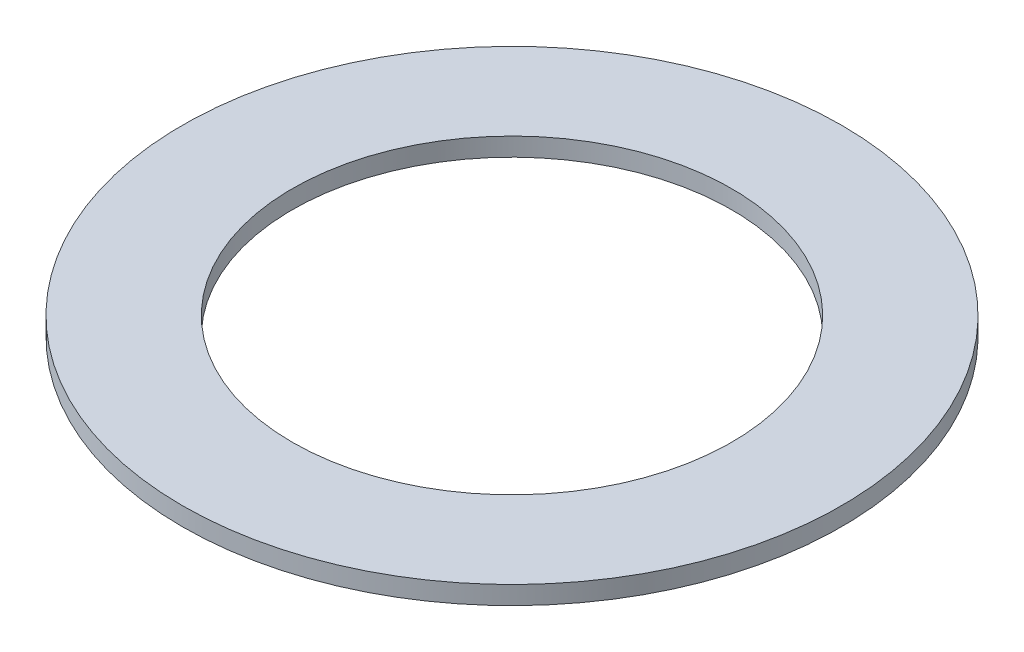
ISO-10303-21;
HEADER;
FILE_DESCRIPTION(('STEP AP214'),'2;1');
FILE_NAME('part.step','',(''),(''),'','','');
FILE_SCHEMA(('AUTOMOTIVE_DESIGN { 1 0 10303 214 1 1 1 1 }'));
ENDSEC;
DATA;
#1=APPLICATION_CONTEXT('core data for automotive mechanical design processes');
#2=APPLICATION_PROTOCOL_DEFINITION('international standard','automotive_design',2000,#1);
#3=PRODUCT_CONTEXT('',#1,'mechanical');
#4=PRODUCT('Part','Part','',(#3));
#5=PRODUCT_RELATED_PRODUCT_CATEGORY('part','',(#4));
#6=PRODUCT_DEFINITION_FORMATION('','',#4);
#7=PRODUCT_DEFINITION_CONTEXT('part definition',#1,'design');
#8=PRODUCT_DEFINITION('design','',#6,#7);
#9=PRODUCT_DEFINITION_SHAPE('','',#8);
#10=(LENGTH_UNIT() NAMED_UNIT(*) SI_UNIT(.MILLI.,.METRE.));
#11=(NAMED_UNIT(*) PLANE_ANGLE_UNIT() SI_UNIT($,.RADIAN.));
#12=(NAMED_UNIT(*) SI_UNIT($,.STERADIAN.) SOLID_ANGLE_UNIT());
#13=UNCERTAINTY_MEASURE_WITH_UNIT(LENGTH_MEASURE(1.E-05),#10,'distance_accuracy_value','');
#14=(GEOMETRIC_REPRESENTATION_CONTEXT(3) GLOBAL_UNCERTAINTY_ASSIGNED_CONTEXT((#13)) GLOBAL_UNIT_ASSIGNED_CONTEXT((#10,
#11,#12)) REPRESENTATION_CONTEXT('',''));
#15=CARTESIAN_POINT('',(0.,0.,0.));
#16=DIRECTION('',(0.,0.,1.));
#17=DIRECTION('',(1.,0.,0.));
#18=AXIS2_PLACEMENT_3D('',#15,#16,#17);
#19=CARTESIAN_POINT('',(0.,0.,0.));
#20=DIRECTION('',(0.,1.,0.));
#21=DIRECTION('',(0.,0.,1.));
#22=AXIS2_PLACEMENT_3D('',#19,#20,#21);
#23=PLANE('',#22);
#24=CARTESIAN_POINT('',(0.,0.,0.));
#25=DIRECTION('',(0.,1.,0.));
#26=DIRECTION('',(0.,0.,1.));
#27=AXIS2_PLACEMENT_3D('',#24,#25,#26);
#28=CIRCLE('',#27,3.);
#29=CARTESIAN_POINT('',(0.,0.,3.));
#30=VERTEX_POINT('',#29);
#31=EDGE_CURVE('E27',#30,#30,#28,.T.);
#32=ORIENTED_EDGE('',*,*,#31,.T.);
#33=EDGE_LOOP('',(#32));
#34=FACE_BOUND('',#33,.T.);
#35=CARTESIAN_POINT('',(0.,0.,0.));
#36=DIRECTION('',(0.,1.,0.));
#37=DIRECTION('',(0.,0.,1.));
#38=AXIS2_PLACEMENT_3D('',#35,#36,#37);
#39=CIRCLE('',#38,4.5);
#40=CARTESIAN_POINT('',(0.,0.,4.5));
#41=VERTEX_POINT('',#40);
#42=EDGE_CURVE('E12',#41,#41,#39,.T.);
#43=ORIENTED_EDGE('',*,*,#42,.F.);
#44=EDGE_LOOP('',(#43));
#45=FACE_BOUND('',#44,.T.);
#46=ADVANCED_FACE('F23',(#34,#45),#23,.F.);
#47=CARTESIAN_POINT('',(0.,0.25,0.));
#48=DIRECTION('',(0.,1.,0.));
#49=DIRECTION('',(0.,0.,1.));
#50=AXIS2_PLACEMENT_3D('',#47,#48,#49);
#51=PLANE('',#50);
#52=CARTESIAN_POINT('',(0.,0.25,0.));
#53=DIRECTION('',(0.,1.,0.));
#54=DIRECTION('',(0.,0.,1.));
#55=AXIS2_PLACEMENT_3D('',#52,#53,#54);
#56=CIRCLE('',#55,3.);
#57=CARTESIAN_POINT('',(0.,0.25,3.));
#58=VERTEX_POINT('',#57);
#59=EDGE_CURVE('E41',#58,#58,#56,.T.);
#60=ORIENTED_EDGE('',*,*,#59,.F.);
#61=EDGE_LOOP('',(#60));
#62=FACE_BOUND('',#61,.T.);
#63=CARTESIAN_POINT('',(0.,0.25,0.));
#64=DIRECTION('',(0.,1.,0.));
#65=DIRECTION('',(0.,0.,1.));
#66=AXIS2_PLACEMENT_3D('',#63,#64,#65);
#67=CIRCLE('',#66,4.5);
#68=CARTESIAN_POINT('',(0.,0.25,4.5));
#69=VERTEX_POINT('',#68);
#70=EDGE_CURVE('E32',#69,#69,#67,.T.);
#71=ORIENTED_EDGE('',*,*,#70,.T.);
#72=EDGE_LOOP('',(#71));
#73=FACE_BOUND('',#72,.T.);
#74=ADVANCED_FACE('F61',(#62,#73),#51,.T.);
#75=CARTESIAN_POINT('',(0.,0.25,0.));
#76=DIRECTION('',(0.,-1.,0.));
#77=DIRECTION('',(0.,0.,-1.));
#78=AXIS2_PLACEMENT_3D('',#75,#76,#77);
#79=CYLINDRICAL_SURFACE('',#78,4.5);
#80=ORIENTED_EDGE('',*,*,#42,.T.);
#81=EDGE_LOOP('',(#80));
#82=FACE_BOUND('',#81,.T.);
#83=ORIENTED_EDGE('',*,*,#70,.F.);
#84=EDGE_LOOP('',(#83));
#85=FACE_BOUND('',#84,.T.);
#86=ADVANCED_FACE('F56',(#82,#85),#79,.T.);
#87=CARTESIAN_POINT('',(0.,0.25,0.));
#88=DIRECTION('',(0.,-1.,0.));
#89=DIRECTION('',(0.,0.,-1.));
#90=AXIS2_PLACEMENT_3D('',#87,#88,#89);
#91=CYLINDRICAL_SURFACE('',#90,3.);
#92=ORIENTED_EDGE('',*,*,#31,.F.);
#93=EDGE_LOOP('',(#92));
#94=FACE_BOUND('',#93,.T.);
#95=ORIENTED_EDGE('',*,*,#59,.T.);
#96=EDGE_LOOP('',(#95));
#97=FACE_BOUND('',#96,.T.);
#98=ADVANCED_FACE('F25',(#94,#97),#91,.F.);
#99=CLOSED_SHELL('',(#46,#74,#86,#98));
#100=MANIFOLD_SOLID_BREP('B1',#99);
#101=ADVANCED_BREP_SHAPE_REPRESENTATION('',(#18,#100),#14);
#102=SHAPE_DEFINITION_REPRESENTATION(#9,#101);
ENDSEC;
END-ISO-10303-21;
